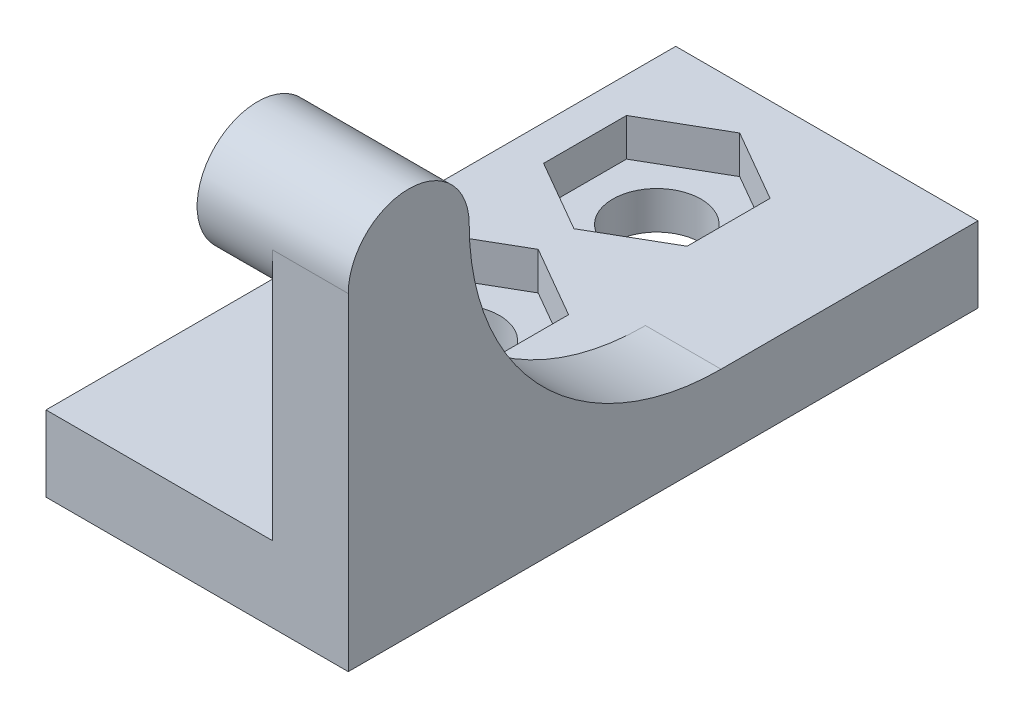
ISO-10303-21;
HEADER;
FILE_DESCRIPTION(('STEP AP214'),'2;1');
FILE_NAME('part.step','',(''),(''),'','','');
FILE_SCHEMA(('AUTOMOTIVE_DESIGN { 1 0 10303 214 1 1 1 1 }'));
ENDSEC;
DATA;
#1=APPLICATION_CONTEXT('core data for automotive mechanical design processes');
#2=APPLICATION_PROTOCOL_DEFINITION('international standard','automotive_design',2000,#1);
#3=PRODUCT_CONTEXT('',#1,'mechanical');
#4=PRODUCT('Part','Part','',(#3));
#5=PRODUCT_RELATED_PRODUCT_CATEGORY('part','',(#4));
#6=PRODUCT_DEFINITION_FORMATION('','',#4);
#7=PRODUCT_DEFINITION_CONTEXT('part definition',#1,'design');
#8=PRODUCT_DEFINITION('design','',#6,#7);
#9=PRODUCT_DEFINITION_SHAPE('','',#8);
#10=(LENGTH_UNIT() NAMED_UNIT(*) SI_UNIT(.MILLI.,.METRE.));
#11=(NAMED_UNIT(*) PLANE_ANGLE_UNIT() SI_UNIT($,.RADIAN.));
#12=(NAMED_UNIT(*) SI_UNIT($,.STERADIAN.) SOLID_ANGLE_UNIT());
#13=UNCERTAINTY_MEASURE_WITH_UNIT(LENGTH_MEASURE(1.E-05),#10,'distance_accuracy_value','');
#14=(GEOMETRIC_REPRESENTATION_CONTEXT(3) GLOBAL_UNCERTAINTY_ASSIGNED_CONTEXT((#13)) GLOBAL_UNIT_ASSIGNED_CONTEXT((#10,
#11,#12)) REPRESENTATION_CONTEXT('',''));
#15=CARTESIAN_POINT('',(0.,0.,0.));
#16=DIRECTION('',(0.,0.,1.));
#17=DIRECTION('',(1.,0.,0.));
#18=AXIS2_PLACEMENT_3D('',#15,#16,#17);
#19=CARTESIAN_POINT('',(3.,0.,0.));
#20=DIRECTION('',(-1.,0.,0.));
#21=DIRECTION('',(0.,0.,1.));
#22=AXIS2_PLACEMENT_3D('',#19,#20,#21);
#23=CYLINDRICAL_SURFACE('',#22,2.4);
#24=CARTESIAN_POINT('',(3.,0.,0.));
#25=DIRECTION('',(1.,0.,0.));
#26=DIRECTION('',(0.,0.,-1.));
#27=AXIS2_PLACEMENT_3D('',#24,#25,#26);
#28=CIRCLE('',#27,2.4);
#29=CARTESIAN_POINT('',(3.,0.,2.4));
#30=VERTEX_POINT('',#29);
#31=CARTESIAN_POINT('',(3.,0.,-2.4));
#32=VERTEX_POINT('',#31);
#33=EDGE_CURVE('E324',#30,#32,#28,.T.);
#34=ORIENTED_EDGE('',*,*,#33,.F.);
#35=DIRECTION('',(-1.,0.,0.));
#36=VECTOR('',#35,1.);
#37=CARTESIAN_POINT('',(6.,0.,2.4));
#38=LINE('',#37,#36);
#39=CARTESIAN_POINT('',(6.,0.,2.4));
#40=VERTEX_POINT('',#39);
#41=EDGE_CURVE('E320',#40,#30,#38,.T.);
#42=ORIENTED_EDGE('',*,*,#41,.F.);
#43=CARTESIAN_POINT('',(6.,0.,0.));
#44=DIRECTION('',(1.,0.,0.));
#45=DIRECTION('',(0.,0.,1.));
#46=AXIS2_PLACEMENT_3D('',#43,#44,#45);
#47=CIRCLE('',#46,2.4);
#48=CARTESIAN_POINT('',(6.,0.,-2.4));
#49=VERTEX_POINT('',#48);
#50=EDGE_CURVE('E309',#49,#40,#47,.T.);
#51=ORIENTED_EDGE('',*,*,#50,.F.);
#52=DIRECTION('',(-1.,0.,0.));
#53=VECTOR('',#52,1.);
#54=CARTESIAN_POINT('',(6.,0.,-2.4));
#55=LINE('',#54,#53);
#56=EDGE_CURVE('E314',#49,#32,#55,.T.);
#57=ORIENTED_EDGE('',*,*,#56,.T.);
#58=EDGE_LOOP('',(#34,#42,#51,#57));
#59=FACE_BOUND('',#58,.T.);
#60=CARTESIAN_POINT('',(0.,0.,0.));
#61=DIRECTION('',(1.,0.,0.));
#62=DIRECTION('',(0.,0.,-1.));
#63=AXIS2_PLACEMENT_3D('',#60,#61,#62);
#64=CIRCLE('',#63,2.4);
#65=CARTESIAN_POINT('',(0.,0.,-2.4));
#66=VERTEX_POINT('',#65);
#67=EDGE_CURVE('E323',#66,#66,#64,.T.);
#68=ORIENTED_EDGE('',*,*,#67,.T.);
#69=EDGE_LOOP('',(#68));
#70=FACE_BOUND('',#69,.T.);
#71=ADVANCED_FACE('F38',(#59,#70),#23,.T.);
#72=CARTESIAN_POINT('',(0.,0.,0.));
#73=DIRECTION('',(1.,0.,0.));
#74=DIRECTION('',(0.,0.,-1.));
#75=AXIS2_PLACEMENT_3D('',#72,#73,#74);
#76=PLANE('',#75);
#77=ORIENTED_EDGE('',*,*,#67,.F.);
#78=EDGE_LOOP('',(#77));
#79=FACE_BOUND('',#78,.T.);
#80=ADVANCED_FACE('F376',(#79),#76,.F.);
#81=CARTESIAN_POINT('',(6.,0.,2.4));
#82=DIRECTION('',(0.,0.,-1.));
#83=DIRECTION('',(0.,1.,0.));
#84=AXIS2_PLACEMENT_3D('',#81,#82,#83);
#85=PLANE('',#84);
#86=DIRECTION('',(0.,-1.,0.));
#87=VECTOR('',#86,1.);
#88=CARTESIAN_POINT('',(3.,0.,2.4));
#89=LINE('',#88,#87);
#90=CARTESIAN_POINT('',(3.,-10.,2.4));
#91=VERTEX_POINT('',#90);
#92=EDGE_CURVE('E308',#30,#91,#89,.T.);
#93=ORIENTED_EDGE('',*,*,#92,.T.);
#94=DIRECTION('',(-1.,0.,0.));
#95=VECTOR('',#94,1.);
#96=CARTESIAN_POINT('',(6.,-10.,2.4));
#97=LINE('',#96,#95);
#98=CARTESIAN_POINT('',(-6.,-10.,2.4));
#99=VERTEX_POINT('',#98);
#100=EDGE_CURVE('E295',#91,#99,#97,.T.);
#101=ORIENTED_EDGE('',*,*,#100,.T.);
#102=DIRECTION('',(0.,1.,0.));
#103=VECTOR('',#102,1.);
#104=CARTESIAN_POINT('',(-6.,-13.,2.4));
#105=LINE('',#104,#103);
#106=CARTESIAN_POINT('',(-6.,-13.,2.4));
#107=VERTEX_POINT('',#106);
#108=EDGE_CURVE('E305',#107,#99,#105,.T.);
#109=ORIENTED_EDGE('',*,*,#108,.F.);
#110=DIRECTION('',(-1.,0.,0.));
#111=VECTOR('',#110,1.);
#112=CARTESIAN_POINT('',(6.,-13.,2.4));
#113=LINE('',#112,#111);
#114=CARTESIAN_POINT('',(6.,-13.,2.4));
#115=VERTEX_POINT('',#114);
#116=EDGE_CURVE('E286',#115,#107,#113,.T.);
#117=ORIENTED_EDGE('',*,*,#116,.F.);
#118=DIRECTION('',(0.,-1.,0.));
#119=VECTOR('',#118,1.);
#120=CARTESIAN_POINT('',(6.,0.,2.4));
#121=LINE('',#120,#119);
#122=EDGE_CURVE('E312',#40,#115,#121,.T.);
#123=ORIENTED_EDGE('',*,*,#122,.F.);
#124=ORIENTED_EDGE('',*,*,#41,.T.);
#125=EDGE_LOOP('',(#93,#101,#109,#117,#123,#124));
#126=FACE_BOUND('',#125,.T.);
#127=ADVANCED_FACE('F346',(#126),#85,.F.);
#128=CARTESIAN_POINT('',(6.,0.,0.));
#129=DIRECTION('',(-1.,0.,0.));
#130=DIRECTION('',(0.,0.,1.));
#131=AXIS2_PLACEMENT_3D('',#128,#129,#130);
#132=PLANE('',#131);
#133=ORIENTED_EDGE('',*,*,#50,.T.);
#134=ORIENTED_EDGE('',*,*,#122,.T.);
#135=DIRECTION('',(0.,0.,1.));
#136=VECTOR('',#135,1.);
#137=CARTESIAN_POINT('',(6.,-13.,2.4));
#138=LINE('',#137,#136);
#139=CARTESIAN_POINT('',(6.,-13.,-22.6));
#140=VERTEX_POINT('',#139);
#141=EDGE_CURVE('E283',#140,#115,#138,.T.);
#142=ORIENTED_EDGE('',*,*,#141,.F.);
#143=DIRECTION('',(0.,1.,0.));
#144=VECTOR('',#143,1.);
#145=CARTESIAN_POINT('',(6.,-13.,-22.6));
#146=LINE('',#145,#144);
#147=CARTESIAN_POINT('',(6.,-10.,-22.6));
#148=VERTEX_POINT('',#147);
#149=EDGE_CURVE('E293',#140,#148,#146,.T.);
#150=ORIENTED_EDGE('',*,*,#149,.T.);
#151=DIRECTION('',(0.,0.,1.));
#152=VECTOR('',#151,1.);
#153=CARTESIAN_POINT('',(6.,-10.,2.4));
#154=LINE('',#153,#152);
#155=CARTESIAN_POINT('',(6.,-10.,-12.4));
#156=VERTEX_POINT('',#155);
#157=EDGE_CURVE('E282',#148,#156,#154,.T.);
#158=ORIENTED_EDGE('',*,*,#157,.T.);
#159=CARTESIAN_POINT('',(6.,0.,-12.4));
#160=DIRECTION('',(-1.,0.,0.));
#161=DIRECTION('',(0.,0.,1.));
#162=AXIS2_PLACEMENT_3D('',#159,#160,#161);
#163=CIRCLE('',#162,10.);
#164=EDGE_CURVE('E11',#156,#49,#163,.T.);
#165=ORIENTED_EDGE('',*,*,#164,.T.);
#166=EDGE_LOOP('',(#133,#134,#142,#150,#158,#165));
#167=FACE_BOUND('',#166,.T.);
#168=ADVANCED_FACE('F341',(#167),#132,.F.);
#169=CARTESIAN_POINT('',(3.,0.,0.));
#170=DIRECTION('',(-1.,0.,0.));
#171=DIRECTION('',(0.,0.,1.));
#172=AXIS2_PLACEMENT_3D('',#169,#170,#171);
#173=PLANE('',#172);
#174=ORIENTED_EDGE('',*,*,#92,.F.);
#175=ORIENTED_EDGE('',*,*,#33,.T.);
#176=CARTESIAN_POINT('',(3.,0.,-12.4));
#177=DIRECTION('',(-1.,0.,0.));
#178=DIRECTION('',(0.,0.,1.));
#179=AXIS2_PLACEMENT_3D('',#176,#177,#178);
#180=CIRCLE('',#179,10.);
#181=CARTESIAN_POINT('',(3.,-10.,-12.4));
#182=VERTEX_POINT('',#181);
#183=EDGE_CURVE('E46',#32,#182,#180,.F.);
#184=ORIENTED_EDGE('',*,*,#183,.T.);
#185=DIRECTION('',(0.,0.,-1.));
#186=VECTOR('',#185,1.);
#187=CARTESIAN_POINT('',(3.,-10.,2.4));
#188=LINE('',#187,#186);
#189=EDGE_CURVE('E53',#91,#182,#188,.T.);
#190=ORIENTED_EDGE('',*,*,#189,.F.);
#191=EDGE_LOOP('',(#174,#175,#184,#190));
#192=FACE_BOUND('',#191,.T.);
#193=ADVANCED_FACE('F335',(#192),#173,.T.);
#194=CARTESIAN_POINT('',(0.,-13.,0.));
#195=DIRECTION('',(0.,1.,0.));
#196=DIRECTION('',(0.,0.,1.));
#197=AXIS2_PLACEMENT_3D('',#194,#195,#196);
#198=PLANE('',#197);
#199=ORIENTED_EDGE('',*,*,#141,.T.);
#200=ORIENTED_EDGE('',*,*,#116,.T.);
#201=DIRECTION('',(0.,0.,-1.));
#202=VECTOR('',#201,1.);
#203=CARTESIAN_POINT('',(-6.,-13.,2.4));
#204=LINE('',#203,#202);
#205=CARTESIAN_POINT('',(-6.,-13.,-22.6));
#206=VERTEX_POINT('',#205);
#207=EDGE_CURVE('E289',#107,#206,#204,.T.);
#208=ORIENTED_EDGE('',*,*,#207,.T.);
#209=DIRECTION('',(1.,0.,0.));
#210=VECTOR('',#209,1.);
#211=CARTESIAN_POINT('',(6.,-13.,-22.6));
#212=LINE('',#211,#210);
#213=EDGE_CURVE('E291',#206,#140,#212,.T.);
#214=ORIENTED_EDGE('',*,*,#213,.T.);
#215=EDGE_LOOP('',(#199,#200,#208,#214));
#216=FACE_BOUND('',#215,.T.);
#217=CARTESIAN_POINT('',(-1.75,-13.,-9.6));
#218=DIRECTION('',(0.,-1.,0.));
#219=DIRECTION('',(0.,0.,-1.));
#220=AXIS2_PLACEMENT_3D('',#217,#218,#219);
#221=CIRCLE('',#220,1.75);
#222=CARTESIAN_POINT('',(-1.75,-13.,-11.35));
#223=VERTEX_POINT('',#222);
#224=EDGE_CURVE('E278',#223,#223,#221,.T.);
#225=ORIENTED_EDGE('',*,*,#224,.F.);
#226=EDGE_LOOP('',(#225));
#227=FACE_BOUND('',#226,.T.);
#228=CARTESIAN_POINT('',(-1.75,-13.,-17.6));
#229=DIRECTION('',(0.,-1.,0.));
#230=DIRECTION('',(0.,0.,-1.));
#231=AXIS2_PLACEMENT_3D('',#228,#229,#230);
#232=CIRCLE('',#231,1.75);
#233=CARTESIAN_POINT('',(-1.75,-13.,-19.35));
#234=VERTEX_POINT('',#233);
#235=EDGE_CURVE('E275',#234,#234,#232,.T.);
#236=ORIENTED_EDGE('',*,*,#235,.F.);
#237=EDGE_LOOP('',(#236));
#238=FACE_BOUND('',#237,.T.);
#239=ADVANCED_FACE('F352',(#216,#227,#238),#198,.F.);
#240=CARTESIAN_POINT('',(0.,-10.,0.));
#241=DIRECTION('',(0.,1.,0.));
#242=DIRECTION('',(0.,0.,1.));
#243=AXIS2_PLACEMENT_3D('',#240,#241,#242);
#244=PLANE('',#243);
#245=DIRECTION('',(0.86602540378444,0.,0.499999999999998));
#246=VECTOR('',#245,1.);
#247=CARTESIAN_POINT('',(-1.75,-10.,-6.30910346561915));
#248=LINE('',#247,#246);
#249=CARTESIAN_POINT('',(-4.6,-10.,-7.95455173280957));
#250=VERTEX_POINT('',#249);
#251=CARTESIAN_POINT('',(-1.75,-10.,-6.30910346561915));
#252=VERTEX_POINT('',#251);
#253=EDGE_CURVE('E175',#250,#252,#248,.T.);
#254=ORIENTED_EDGE('',*,*,#253,.F.);
#255=DIRECTION('',(0.,0.,1.));
#256=VECTOR('',#255,1.);
#257=CARTESIAN_POINT('',(-4.6,-10.,-7.95455173280957));
#258=LINE('',#257,#256);
#259=CARTESIAN_POINT('',(-4.6,-10.,-11.2454482671904));
#260=VERTEX_POINT('',#259);
#261=EDGE_CURVE('E193',#260,#250,#258,.T.);
#262=ORIENTED_EDGE('',*,*,#261,.F.);
#263=DIRECTION('',(-0.86602540378444,0.,0.499999999999998));
#264=VECTOR('',#263,1.);
#265=CARTESIAN_POINT('',(-4.6,-10.,-11.2454482671904));
#266=LINE('',#265,#264);
#267=CARTESIAN_POINT('',(-1.75,-10.,-12.8908965343809));
#268=VERTEX_POINT('',#267);
#269=EDGE_CURVE('E196',#268,#260,#266,.T.);
#270=ORIENTED_EDGE('',*,*,#269,.F.);
#271=DIRECTION('',(-0.86602540378444,0.,-0.499999999999998));
#272=VECTOR('',#271,1.);
#273=CARTESIAN_POINT('',(-1.75,-10.,-12.8908965343809));
#274=LINE('',#273,#272);
#275=CARTESIAN_POINT('',(1.1,-10.,-11.2454482671904));
#276=VERTEX_POINT('',#275);
#277=EDGE_CURVE('E213',#276,#268,#274,.T.);
#278=ORIENTED_EDGE('',*,*,#277,.F.);
#279=DIRECTION('',(0.,0.,-1.));
#280=VECTOR('',#279,1.);
#281=CARTESIAN_POINT('',(1.1,-10.,-11.2454482671904));
#282=LINE('',#281,#280);
#283=CARTESIAN_POINT('',(1.1,-10.,-7.95455173280957));
#284=VERTEX_POINT('',#283);
#285=EDGE_CURVE('E210',#284,#276,#282,.T.);
#286=ORIENTED_EDGE('',*,*,#285,.F.);
#287=DIRECTION('',(0.86602540378444,0.,-0.499999999999998));
#288=VECTOR('',#287,1.);
#289=CARTESIAN_POINT('',(1.1,-10.,-7.95455173280957));
#290=LINE('',#289,#288);
#291=EDGE_CURVE('E207',#252,#284,#290,.T.);
#292=ORIENTED_EDGE('',*,*,#291,.F.);
#293=EDGE_LOOP('',(#254,#262,#270,#278,#286,#292));
#294=FACE_BOUND('',#293,.T.);
#295=DIRECTION('',(0.86602540378444,0.,0.499999999999997));
#296=VECTOR('',#295,1.);
#297=CARTESIAN_POINT('',(-1.74999999999999,-10.,-14.3091034656191));
#298=LINE('',#297,#296);
#299=CARTESIAN_POINT('',(-4.6,-10.,-15.9545517328096));
#300=VERTEX_POINT('',#299);
#301=CARTESIAN_POINT('',(-1.74999999999999,-10.,-14.3091034656191));
#302=VERTEX_POINT('',#301);
#303=EDGE_CURVE('E208',#300,#302,#298,.T.);
#304=ORIENTED_EDGE('',*,*,#303,.F.);
#305=DIRECTION('',(0.,0.,1.));
#306=VECTOR('',#305,1.);
#307=CARTESIAN_POINT('',(-4.6,-10.,-15.9545517328096));
#308=LINE('',#307,#306);
#309=CARTESIAN_POINT('',(-4.6,-10.,-19.2454482671904));
#310=VERTEX_POINT('',#309);
#311=EDGE_CURVE('E242',#310,#300,#308,.T.);
#312=ORIENTED_EDGE('',*,*,#311,.F.);
#313=DIRECTION('',(-0.86602540378444,0.,0.499999999999998));
#314=VECTOR('',#313,1.);
#315=CARTESIAN_POINT('',(-4.6,-10.,-19.2454482671904));
#316=LINE('',#315,#314);
#317=CARTESIAN_POINT('',(-1.75,-10.,-20.8908965343809));
#318=VERTEX_POINT('',#317);
#319=EDGE_CURVE('E245',#318,#310,#316,.T.);
#320=ORIENTED_EDGE('',*,*,#319,.F.);
#321=DIRECTION('',(-0.86602540378444,0.,-0.499999999999998));
#322=VECTOR('',#321,1.);
#323=CARTESIAN_POINT('',(-1.75,-10.,-20.8908965343809));
#324=LINE('',#323,#322);
#325=CARTESIAN_POINT('',(1.1,-10.,-19.2454482671904));
#326=VERTEX_POINT('',#325);
#327=EDGE_CURVE('E249',#326,#318,#324,.T.);
#328=ORIENTED_EDGE('',*,*,#327,.F.);
#329=DIRECTION('',(0.,0.,-1.));
#330=VECTOR('',#329,1.);
#331=CARTESIAN_POINT('',(1.1,-10.,-19.2454482671904));
#332=LINE('',#331,#330);
#333=CARTESIAN_POINT('',(1.1,-10.,-15.9545517328096));
#334=VERTEX_POINT('',#333);
#335=EDGE_CURVE('E252',#334,#326,#332,.T.);
#336=ORIENTED_EDGE('',*,*,#335,.F.);
#337=DIRECTION('',(0.86602540378444,0.,-0.499999999999998));
#338=VECTOR('',#337,1.);
#339=CARTESIAN_POINT('',(1.1,-10.,-15.9545517328096));
#340=LINE('',#339,#338);
#341=EDGE_CURVE('E255',#302,#334,#340,.T.);
#342=ORIENTED_EDGE('',*,*,#341,.F.);
#343=EDGE_LOOP('',(#304,#312,#320,#328,#336,#342));
#344=FACE_BOUND('',#343,.T.);
#345=ORIENTED_EDGE('',*,*,#189,.T.);
#346=DIRECTION('',(-1.,0.,0.));
#347=VECTOR('',#346,1.);
#348=CARTESIAN_POINT('',(0.,-10.,-12.4));
#349=LINE('',#348,#347);
#350=EDGE_CURVE('E58',#182,#156,#349,.F.);
#351=ORIENTED_EDGE('',*,*,#350,.T.);
#352=ORIENTED_EDGE('',*,*,#157,.F.);
#353=DIRECTION('',(1.,0.,0.));
#354=VECTOR('',#353,1.);
#355=CARTESIAN_POINT('',(6.,-10.,-22.6));
#356=LINE('',#355,#354);
#357=CARTESIAN_POINT('',(-6.,-10.,-22.6));
#358=VERTEX_POINT('',#357);
#359=EDGE_CURVE('E287',#358,#148,#356,.T.);
#360=ORIENTED_EDGE('',*,*,#359,.F.);
#361=DIRECTION('',(0.,0.,-1.));
#362=VECTOR('',#361,1.);
#363=CARTESIAN_POINT('',(-6.,-10.,2.4));
#364=LINE('',#363,#362);
#365=EDGE_CURVE('E297',#99,#358,#364,.T.);
#366=ORIENTED_EDGE('',*,*,#365,.F.);
#367=ORIENTED_EDGE('',*,*,#100,.F.);
#368=EDGE_LOOP('',(#345,#351,#352,#360,#366,#367));
#369=FACE_BOUND('',#368,.T.);
#370=ADVANCED_FACE('F361',(#294,#344,#369),#244,.T.);
#371=CARTESIAN_POINT('',(-6.,-13.,2.4));
#372=DIRECTION('',(1.,0.,0.));
#373=DIRECTION('',(0.,0.,-1.));
#374=AXIS2_PLACEMENT_3D('',#371,#372,#373);
#375=PLANE('',#374);
#376=ORIENTED_EDGE('',*,*,#365,.T.);
#377=DIRECTION('',(0.,1.,0.));
#378=VECTOR('',#377,1.);
#379=CARTESIAN_POINT('',(-6.,-13.,-22.6));
#380=LINE('',#379,#378);
#381=EDGE_CURVE('E302',#206,#358,#380,.T.);
#382=ORIENTED_EDGE('',*,*,#381,.F.);
#383=ORIENTED_EDGE('',*,*,#207,.F.);
#384=ORIENTED_EDGE('',*,*,#108,.T.);
#385=EDGE_LOOP('',(#376,#382,#383,#384));
#386=FACE_BOUND('',#385,.T.);
#387=ADVANCED_FACE('F363',(#386),#375,.F.);
#388=CARTESIAN_POINT('',(6.,-13.,-22.6));
#389=DIRECTION('',(0.,0.,1.));
#390=DIRECTION('',(1.,0.,0.));
#391=AXIS2_PLACEMENT_3D('',#388,#389,#390);
#392=PLANE('',#391);
#393=ORIENTED_EDGE('',*,*,#359,.T.);
#394=ORIENTED_EDGE('',*,*,#149,.F.);
#395=ORIENTED_EDGE('',*,*,#213,.F.);
#396=ORIENTED_EDGE('',*,*,#381,.T.);
#397=EDGE_LOOP('',(#393,#394,#395,#396));
#398=FACE_BOUND('',#397,.T.);
#399=ADVANCED_FACE('F358',(#398),#392,.F.);
#400=CARTESIAN_POINT('',(-1.75,-13.,-9.6));
#401=DIRECTION('',(0.,1.,0.));
#402=DIRECTION('',(0.,0.,1.));
#403=AXIS2_PLACEMENT_3D('',#400,#401,#402);
#404=CYLINDRICAL_SURFACE('',#403,1.75);
#405=CARTESIAN_POINT('',(-1.75,-11.5,-9.6));
#406=DIRECTION('',(0.,-1.,0.));
#407=DIRECTION('',(0.,0.,-1.));
#408=AXIS2_PLACEMENT_3D('',#405,#406,#407);
#409=CIRCLE('',#408,1.75);
#410=CARTESIAN_POINT('',(-1.75,-11.5,-11.35));
#411=VERTEX_POINT('',#410);
#412=EDGE_CURVE('E279',#411,#411,#409,.T.);
#413=ORIENTED_EDGE('',*,*,#412,.F.);
#414=EDGE_LOOP('',(#413));
#415=FACE_BOUND('',#414,.T.);
#416=ORIENTED_EDGE('',*,*,#224,.T.);
#417=EDGE_LOOP('',(#416));
#418=FACE_BOUND('',#417,.T.);
#419=ADVANCED_FACE('F370',(#415,#418),#404,.F.);
#420=CARTESIAN_POINT('',(-1.75,-13.,-17.6));
#421=DIRECTION('',(0.,1.,0.));
#422=DIRECTION('',(0.,0.,1.));
#423=AXIS2_PLACEMENT_3D('',#420,#421,#422);
#424=CYLINDRICAL_SURFACE('',#423,1.75);
#425=CARTESIAN_POINT('',(-1.75,-11.5,-17.6));
#426=DIRECTION('',(0.,-1.,0.));
#427=DIRECTION('',(0.,0.,-1.));
#428=AXIS2_PLACEMENT_3D('',#425,#426,#427);
#429=CIRCLE('',#428,1.75);
#430=CARTESIAN_POINT('',(-1.75,-11.5,-19.35));
#431=VERTEX_POINT('',#430);
#432=EDGE_CURVE('E220',#431,#431,#429,.T.);
#433=ORIENTED_EDGE('',*,*,#432,.F.);
#434=EDGE_LOOP('',(#433));
#435=FACE_BOUND('',#434,.T.);
#436=ORIENTED_EDGE('',*,*,#235,.T.);
#437=EDGE_LOOP('',(#436));
#438=FACE_BOUND('',#437,.T.);
#439=ADVANCED_FACE('F523',(#435,#438),#424,.F.);
#440=CARTESIAN_POINT('',(-1.74999999999999,-11.5,-14.3091034656191));
#441=DIRECTION('',(-0.499999999999997,0.,0.86602540378444));
#442=DIRECTION('',(0.86602540378444,0.,0.499999999999997));
#443=AXIS2_PLACEMENT_3D('',#440,#441,#442);
#444=PLANE('',#443);
#445=ORIENTED_EDGE('',*,*,#303,.T.);
#446=DIRECTION('',(0.,1.,0.));
#447=VECTOR('',#446,1.);
#448=CARTESIAN_POINT('',(-1.74999999999999,-11.5,-14.3091034656191));
#449=LINE('',#448,#447);
#450=CARTESIAN_POINT('',(-1.74999999999999,-11.5,-14.3091034656191));
#451=VERTEX_POINT('',#450);
#452=EDGE_CURVE('E228',#451,#302,#449,.T.);
#453=ORIENTED_EDGE('',*,*,#452,.F.);
#454=DIRECTION('',(0.86602540378444,0.,0.499999999999997));
#455=VECTOR('',#454,1.);
#456=CARTESIAN_POINT('',(-1.74999999999999,-11.5,-14.3091034656191));
#457=LINE('',#456,#455);
#458=CARTESIAN_POINT('',(-4.6,-11.5,-15.9545517328096));
#459=VERTEX_POINT('',#458);
#460=EDGE_CURVE('E246',#459,#451,#457,.T.);
#461=ORIENTED_EDGE('',*,*,#460,.F.);
#462=DIRECTION('',(0.,1.,0.));
#463=VECTOR('',#462,1.);
#464=CARTESIAN_POINT('',(-4.6,-11.5,-15.9545517328096));
#465=LINE('',#464,#463);
#466=EDGE_CURVE('E240',#459,#300,#465,.T.);
#467=ORIENTED_EDGE('',*,*,#466,.T.);
#468=EDGE_LOOP('',(#445,#453,#461,#467));
#469=FACE_BOUND('',#468,.T.);
#470=ADVANCED_FACE('F515',(#469),#444,.F.);
#471=CARTESIAN_POINT('',(-4.6,-11.5,-15.9545517328096));
#472=DIRECTION('',(-1.,0.,0.));
#473=DIRECTION('',(0.,0.,1.));
#474=AXIS2_PLACEMENT_3D('',#471,#472,#473);
#475=PLANE('',#474);
#476=ORIENTED_EDGE('',*,*,#311,.T.);
#477=ORIENTED_EDGE('',*,*,#466,.F.);
#478=DIRECTION('',(0.,0.,1.));
#479=VECTOR('',#478,1.);
#480=CARTESIAN_POINT('',(-4.6,-11.5,-15.9545517328096));
#481=LINE('',#480,#479);
#482=CARTESIAN_POINT('',(-4.6,-11.5,-19.2454482671904));
#483=VERTEX_POINT('',#482);
#484=EDGE_CURVE('E231',#483,#459,#481,.T.);
#485=ORIENTED_EDGE('',*,*,#484,.F.);
#486=DIRECTION('',(0.,1.,0.));
#487=VECTOR('',#486,1.);
#488=CARTESIAN_POINT('',(-4.6,-11.5,-19.2454482671904));
#489=LINE('',#488,#487);
#490=EDGE_CURVE('E238',#483,#310,#489,.T.);
#491=ORIENTED_EDGE('',*,*,#490,.T.);
#492=EDGE_LOOP('',(#476,#477,#485,#491));
#493=FACE_BOUND('',#492,.T.);
#494=ADVANCED_FACE('F507',(#493),#475,.F.);
#495=CARTESIAN_POINT('',(-4.6,-11.5,-19.2454482671904));
#496=DIRECTION('',(-0.499999999999998,0.,-0.86602540378444));
#497=DIRECTION('',(-0.86602540378444,0.,0.499999999999998));
#498=AXIS2_PLACEMENT_3D('',#495,#496,#497);
#499=PLANE('',#498);
#500=ORIENTED_EDGE('',*,*,#319,.T.);
#501=ORIENTED_EDGE('',*,*,#490,.F.);
#502=DIRECTION('',(-0.86602540378444,0.,0.499999999999998));
#503=VECTOR('',#502,1.);
#504=CARTESIAN_POINT('',(-4.6,-11.5,-19.2454482671904));
#505=LINE('',#504,#503);
#506=CARTESIAN_POINT('',(-1.75,-11.5,-20.8908965343809));
#507=VERTEX_POINT('',#506);
#508=EDGE_CURVE('E261',#507,#483,#505,.T.);
#509=ORIENTED_EDGE('',*,*,#508,.F.);
#510=DIRECTION('',(0.,1.,0.));
#511=VECTOR('',#510,1.);
#512=CARTESIAN_POINT('',(-1.75,-11.5,-20.8908965343809));
#513=LINE('',#512,#511);
#514=EDGE_CURVE('E236',#507,#318,#513,.T.);
#515=ORIENTED_EDGE('',*,*,#514,.T.);
#516=EDGE_LOOP('',(#500,#501,#509,#515));
#517=FACE_BOUND('',#516,.T.);
#518=ADVANCED_FACE('F499',(#517),#499,.F.);
#519=CARTESIAN_POINT('',(-1.75,-11.5,-20.8908965343809));
#520=DIRECTION('',(0.499999999999998,0.,-0.86602540378444));
#521=DIRECTION('',(-0.86602540378444,0.,-0.499999999999998));
#522=AXIS2_PLACEMENT_3D('',#519,#520,#521);
#523=PLANE('',#522);
#524=ORIENTED_EDGE('',*,*,#327,.T.);
#525=ORIENTED_EDGE('',*,*,#514,.F.);
#526=DIRECTION('',(-0.86602540378444,0.,-0.499999999999998));
#527=VECTOR('',#526,1.);
#528=CARTESIAN_POINT('',(-1.75,-11.5,-20.8908965343809));
#529=LINE('',#528,#527);
#530=CARTESIAN_POINT('',(1.1,-11.5,-19.2454482671904));
#531=VERTEX_POINT('',#530);
#532=EDGE_CURVE('E264',#531,#507,#529,.T.);
#533=ORIENTED_EDGE('',*,*,#532,.F.);
#534=DIRECTION('',(0.,1.,0.));
#535=VECTOR('',#534,1.);
#536=CARTESIAN_POINT('',(1.1,-11.5,-19.2454482671904));
#537=LINE('',#536,#535);
#538=EDGE_CURVE('E234',#531,#326,#537,.T.);
#539=ORIENTED_EDGE('',*,*,#538,.T.);
#540=EDGE_LOOP('',(#524,#525,#533,#539));
#541=FACE_BOUND('',#540,.T.);
#542=ADVANCED_FACE('F491',(#541),#523,.F.);
#543=CARTESIAN_POINT('',(1.1,-11.5,-19.2454482671904));
#544=DIRECTION('',(1.,0.,0.));
#545=DIRECTION('',(0.,0.,-1.));
#546=AXIS2_PLACEMENT_3D('',#543,#544,#545);
#547=PLANE('',#546);
#548=ORIENTED_EDGE('',*,*,#335,.T.);
#549=ORIENTED_EDGE('',*,*,#538,.F.);
#550=DIRECTION('',(0.,0.,-1.));
#551=VECTOR('',#550,1.);
#552=CARTESIAN_POINT('',(1.1,-11.5,-19.2454482671904));
#553=LINE('',#552,#551);
#554=CARTESIAN_POINT('',(1.1,-11.5,-15.9545517328096));
#555=VERTEX_POINT('',#554);
#556=EDGE_CURVE('E267',#555,#531,#553,.T.);
#557=ORIENTED_EDGE('',*,*,#556,.F.);
#558=DIRECTION('',(0.,1.,0.));
#559=VECTOR('',#558,1.);
#560=CARTESIAN_POINT('',(1.1,-11.5,-15.9545517328096));
#561=LINE('',#560,#559);
#562=EDGE_CURVE('E232',#555,#334,#561,.T.);
#563=ORIENTED_EDGE('',*,*,#562,.T.);
#564=EDGE_LOOP('',(#548,#549,#557,#563));
#565=FACE_BOUND('',#564,.T.);
#566=ADVANCED_FACE('F483',(#565),#547,.F.);
#567=CARTESIAN_POINT('',(1.1,-11.5,-15.9545517328096));
#568=DIRECTION('',(0.499999999999998,0.,0.86602540378444));
#569=DIRECTION('',(0.86602540378444,0.,-0.499999999999998));
#570=AXIS2_PLACEMENT_3D('',#567,#568,#569);
#571=PLANE('',#570);
#572=ORIENTED_EDGE('',*,*,#341,.T.);
#573=ORIENTED_EDGE('',*,*,#562,.F.);
#574=DIRECTION('',(0.86602540378444,0.,-0.499999999999998));
#575=VECTOR('',#574,1.);
#576=CARTESIAN_POINT('',(1.1,-11.5,-15.9545517328096));
#577=LINE('',#576,#575);
#578=EDGE_CURVE('E270',#451,#555,#577,.T.);
#579=ORIENTED_EDGE('',*,*,#578,.F.);
#580=ORIENTED_EDGE('',*,*,#452,.T.);
#581=EDGE_LOOP('',(#572,#573,#579,#580));
#582=FACE_BOUND('',#581,.T.);
#583=ADVANCED_FACE('F475',(#582),#571,.F.);
#584=CARTESIAN_POINT('',(0.,-11.5,0.));
#585=DIRECTION('',(0.,-1.,0.));
#586=DIRECTION('',(0.,0.,-1.));
#587=AXIS2_PLACEMENT_3D('',#584,#585,#586);
#588=PLANE('',#587);
#589=ORIENTED_EDGE('',*,*,#432,.T.);
#590=EDGE_LOOP('',(#589));
#591=FACE_BOUND('',#590,.T.);
#592=ORIENTED_EDGE('',*,*,#460,.T.);
#593=ORIENTED_EDGE('',*,*,#578,.T.);
#594=ORIENTED_EDGE('',*,*,#556,.T.);
#595=ORIENTED_EDGE('',*,*,#532,.T.);
#596=ORIENTED_EDGE('',*,*,#508,.T.);
#597=ORIENTED_EDGE('',*,*,#484,.T.);
#598=EDGE_LOOP('',(#592,#593,#594,#595,#596,#597));
#599=FACE_BOUND('',#598,.T.);
#600=ADVANCED_FACE('F468',(#591,#599),#588,.F.);
#601=CARTESIAN_POINT('',(-1.75,-11.5,-6.30910346561915));
#602=DIRECTION('',(-0.499999999999998,0.,0.86602540378444));
#603=DIRECTION('',(0.86602540378444,0.,0.499999999999998));
#604=AXIS2_PLACEMENT_3D('',#601,#602,#603);
#605=PLANE('',#604);
#606=ORIENTED_EDGE('',*,*,#253,.T.);
#607=DIRECTION('',(0.,1.,0.));
#608=VECTOR('',#607,1.);
#609=CARTESIAN_POINT('',(-1.75,-11.5,-6.30910346561915));
#610=LINE('',#609,#608);
#611=CARTESIAN_POINT('',(-1.75,-11.5,-6.30910346561915));
#612=VERTEX_POINT('',#611);
#613=EDGE_CURVE('E168',#612,#252,#610,.T.);
#614=ORIENTED_EDGE('',*,*,#613,.F.);
#615=DIRECTION('',(0.86602540378444,0.,0.499999999999998));
#616=VECTOR('',#615,1.);
#617=CARTESIAN_POINT('',(-1.75,-11.5,-6.30910346561915));
#618=LINE('',#617,#616);
#619=CARTESIAN_POINT('',(-4.6,-11.5,-7.95455173280957));
#620=VERTEX_POINT('',#619);
#621=EDGE_CURVE('E172',#620,#612,#618,.T.);
#622=ORIENTED_EDGE('',*,*,#621,.F.);
#623=DIRECTION('',(0.,1.,0.));
#624=VECTOR('',#623,1.);
#625=CARTESIAN_POINT('',(-4.6,-11.5,-7.95455173280957));
#626=LINE('',#625,#624);
#627=EDGE_CURVE('E218',#620,#250,#626,.T.);
#628=ORIENTED_EDGE('',*,*,#627,.T.);
#629=EDGE_LOOP('',(#606,#614,#622,#628));
#630=FACE_BOUND('',#629,.T.);
#631=ADVANCED_FACE('F170',(#630),#605,.F.);
#632=CARTESIAN_POINT('',(-4.6,-11.5,-7.95455173280957));
#633=DIRECTION('',(-1.,0.,0.));
#634=DIRECTION('',(0.,0.,1.));
#635=AXIS2_PLACEMENT_3D('',#632,#633,#634);
#636=PLANE('',#635);
#637=ORIENTED_EDGE('',*,*,#261,.T.);
#638=ORIENTED_EDGE('',*,*,#627,.F.);
#639=DIRECTION('',(0.,0.,1.));
#640=VECTOR('',#639,1.);
#641=CARTESIAN_POINT('',(-4.6,-11.5,-7.95455173280957));
#642=LINE('',#641,#640);
#643=CARTESIAN_POINT('',(-4.6,-11.5,-11.2454482671904));
#644=VERTEX_POINT('',#643);
#645=EDGE_CURVE('E180',#644,#620,#642,.T.);
#646=ORIENTED_EDGE('',*,*,#645,.F.);
#647=DIRECTION('',(0.,1.,0.));
#648=VECTOR('',#647,1.);
#649=CARTESIAN_POINT('',(-4.6,-11.5,-11.2454482671904));
#650=LINE('',#649,#648);
#651=EDGE_CURVE('E221',#644,#260,#650,.T.);
#652=ORIENTED_EDGE('',*,*,#651,.T.);
#653=EDGE_LOOP('',(#637,#638,#646,#652));
#654=FACE_BOUND('',#653,.T.);
#655=ADVANCED_FACE('F453',(#654),#636,.F.);
#656=CARTESIAN_POINT('',(-4.6,-11.5,-11.2454482671904));
#657=DIRECTION('',(-0.499999999999998,0.,-0.86602540378444));
#658=DIRECTION('',(-0.86602540378444,0.,0.499999999999998));
#659=AXIS2_PLACEMENT_3D('',#656,#657,#658);
#660=PLANE('',#659);
#661=ORIENTED_EDGE('',*,*,#269,.T.);
#662=ORIENTED_EDGE('',*,*,#651,.F.);
#663=DIRECTION('',(-0.86602540378444,0.,0.499999999999998));
#664=VECTOR('',#663,1.);
#665=CARTESIAN_POINT('',(-4.6,-11.5,-11.2454482671904));
#666=LINE('',#665,#664);
#667=CARTESIAN_POINT('',(-1.75,-11.5,-12.8908965343809));
#668=VERTEX_POINT('',#667);
#669=EDGE_CURVE('E203',#668,#644,#666,.T.);
#670=ORIENTED_EDGE('',*,*,#669,.F.);
#671=DIRECTION('',(0.,1.,0.));
#672=VECTOR('',#671,1.);
#673=CARTESIAN_POINT('',(-1.75,-11.5,-12.8908965343809));
#674=LINE('',#673,#672);
#675=EDGE_CURVE('E223',#668,#268,#674,.T.);
#676=ORIENTED_EDGE('',*,*,#675,.T.);
#677=EDGE_LOOP('',(#661,#662,#670,#676));
#678=FACE_BOUND('',#677,.T.);
#679=ADVANCED_FACE('F445',(#678),#660,.F.);
#680=CARTESIAN_POINT('',(-1.75,-11.5,-12.8908965343809));
#681=DIRECTION('',(0.499999999999998,0.,-0.86602540378444));
#682=DIRECTION('',(-0.86602540378444,0.,-0.499999999999998));
#683=AXIS2_PLACEMENT_3D('',#680,#681,#682);
#684=PLANE('',#683);
#685=ORIENTED_EDGE('',*,*,#277,.T.);
#686=ORIENTED_EDGE('',*,*,#675,.F.);
#687=DIRECTION('',(-0.86602540378444,0.,-0.499999999999998));
#688=VECTOR('',#687,1.);
#689=CARTESIAN_POINT('',(-1.75,-11.5,-12.8908965343809));
#690=LINE('',#689,#688);
#691=CARTESIAN_POINT('',(1.1,-11.5,-11.2454482671904));
#692=VERTEX_POINT('',#691);
#693=EDGE_CURVE('E200',#692,#668,#690,.T.);
#694=ORIENTED_EDGE('',*,*,#693,.F.);
#695=DIRECTION('',(0.,1.,0.));
#696=VECTOR('',#695,1.);
#697=CARTESIAN_POINT('',(1.1,-11.5,-11.2454482671904));
#698=LINE('',#697,#696);
#699=EDGE_CURVE('E225',#692,#276,#698,.T.);
#700=ORIENTED_EDGE('',*,*,#699,.T.);
#701=EDGE_LOOP('',(#685,#686,#694,#700));
#702=FACE_BOUND('',#701,.T.);
#703=ADVANCED_FACE('F437',(#702),#684,.F.);
#704=CARTESIAN_POINT('',(1.1,-11.5,-11.2454482671904));
#705=DIRECTION('',(1.,0.,0.));
#706=DIRECTION('',(0.,0.,-1.));
#707=AXIS2_PLACEMENT_3D('',#704,#705,#706);
#708=PLANE('',#707);
#709=ORIENTED_EDGE('',*,*,#285,.T.);
#710=ORIENTED_EDGE('',*,*,#699,.F.);
#711=DIRECTION('',(0.,0.,-1.));
#712=VECTOR('',#711,1.);
#713=CARTESIAN_POINT('',(1.1,-11.5,-11.2454482671904));
#714=LINE('',#713,#712);
#715=CARTESIAN_POINT('',(1.1,-11.5,-7.95455173280957));
#716=VERTEX_POINT('',#715);
#717=EDGE_CURVE('E188',#716,#692,#714,.T.);
#718=ORIENTED_EDGE('',*,*,#717,.F.);
#719=DIRECTION('',(0.,1.,0.));
#720=VECTOR('',#719,1.);
#721=CARTESIAN_POINT('',(1.1,-11.5,-7.95455173280957));
#722=LINE('',#721,#720);
#723=EDGE_CURVE('E179',#716,#284,#722,.T.);
#724=ORIENTED_EDGE('',*,*,#723,.T.);
#725=EDGE_LOOP('',(#709,#710,#718,#724));
#726=FACE_BOUND('',#725,.T.);
#727=ADVANCED_FACE('F430',(#726),#708,.F.);
#728=CARTESIAN_POINT('',(1.1,-11.5,-7.95455173280957));
#729=DIRECTION('',(0.499999999999998,0.,0.86602540378444));
#730=DIRECTION('',(0.86602540378444,0.,-0.499999999999998));
#731=AXIS2_PLACEMENT_3D('',#728,#729,#730);
#732=PLANE('',#731);
#733=ORIENTED_EDGE('',*,*,#291,.T.);
#734=ORIENTED_EDGE('',*,*,#723,.F.);
#735=DIRECTION('',(0.86602540378444,0.,-0.499999999999998));
#736=VECTOR('',#735,1.);
#737=CARTESIAN_POINT('',(1.1,-11.5,-7.95455173280957));
#738=LINE('',#737,#736);
#739=EDGE_CURVE('E183',#612,#716,#738,.T.);
#740=ORIENTED_EDGE('',*,*,#739,.F.);
#741=ORIENTED_EDGE('',*,*,#613,.T.);
#742=EDGE_LOOP('',(#733,#734,#740,#741));
#743=FACE_BOUND('',#742,.T.);
#744=ADVANCED_FACE('F184',(#743),#732,.F.);
#745=CARTESIAN_POINT('',(0.,-11.5,0.));
#746=DIRECTION('',(0.,-1.,0.));
#747=DIRECTION('',(0.,0.,-1.));
#748=AXIS2_PLACEMENT_3D('',#745,#746,#747);
#749=PLANE('',#748);
#750=ORIENTED_EDGE('',*,*,#412,.T.);
#751=EDGE_LOOP('',(#750));
#752=FACE_BOUND('',#751,.T.);
#753=ORIENTED_EDGE('',*,*,#621,.T.);
#754=ORIENTED_EDGE('',*,*,#739,.T.);
#755=ORIENTED_EDGE('',*,*,#717,.T.);
#756=ORIENTED_EDGE('',*,*,#693,.T.);
#757=ORIENTED_EDGE('',*,*,#669,.T.);
#758=ORIENTED_EDGE('',*,*,#645,.T.);
#759=EDGE_LOOP('',(#753,#754,#755,#756,#757,#758));
#760=FACE_BOUND('',#759,.T.);
#761=ADVANCED_FACE('F190',(#752,#760),#749,.F.);
#762=CARTESIAN_POINT('',(6.,0.,-12.4));
#763=DIRECTION('',(-1.,0.,0.));
#764=DIRECTION('',(0.,0.,1.));
#765=AXIS2_PLACEMENT_3D('',#762,#763,#764);
#766=CYLINDRICAL_SURFACE('',#765,10.);
#767=ORIENTED_EDGE('',*,*,#164,.F.);
#768=ORIENTED_EDGE('',*,*,#350,.F.);
#769=ORIENTED_EDGE('',*,*,#183,.F.);
#770=ORIENTED_EDGE('',*,*,#56,.F.);
#771=EDGE_LOOP('',(#767,#768,#769,#770));
#772=FACE_BOUND('',#771,.T.);
#773=ADVANCED_FACE('F40',(#772),#766,.F.);
#774=CLOSED_SHELL('',(#71,#80,#127,#168,#193,#239,#370,#387,#399,#419,#439,#470,#494,#518,#542,
#566,#583,#600,#631,#655,#679,#703,#727,#744,#761,#773));
#775=MANIFOLD_SOLID_BREP('B2',#774);
#776=ADVANCED_BREP_SHAPE_REPRESENTATION('',(#18,#775),#14);
#777=SHAPE_DEFINITION_REPRESENTATION(#9,#776);
ENDSEC;
END-ISO-10303-21;
